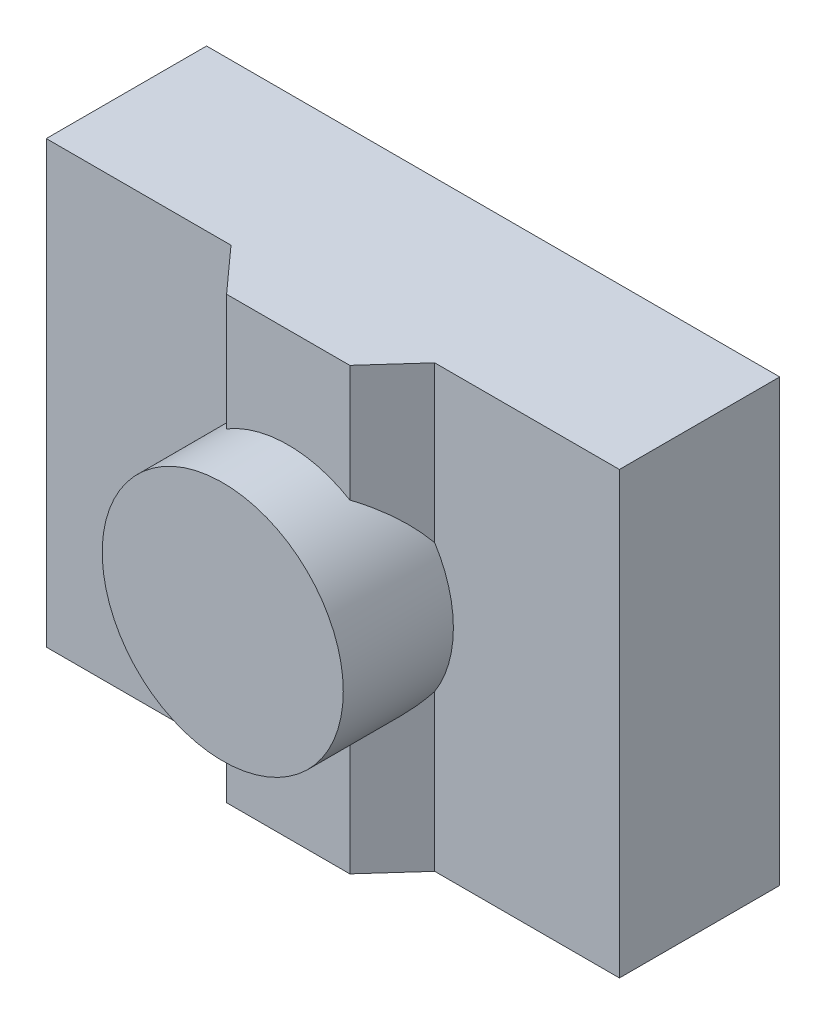
ISO-10303-21;
HEADER;
FILE_DESCRIPTION(('STEP AP214'),'2;1');
FILE_NAME('part.step','',(''),(''),'','','');
FILE_SCHEMA(('AUTOMOTIVE_DESIGN { 1 0 10303 214 1 1 1 1 }'));
ENDSEC;
DATA;
#1=APPLICATION_CONTEXT('core data for automotive mechanical design processes');
#2=APPLICATION_PROTOCOL_DEFINITION('international standard','automotive_design',2000,#1);
#3=PRODUCT_CONTEXT('',#1,'mechanical');
#4=PRODUCT('Part','Part','',(#3));
#5=PRODUCT_RELATED_PRODUCT_CATEGORY('part','',(#4));
#6=PRODUCT_DEFINITION_FORMATION('','',#4);
#7=PRODUCT_DEFINITION_CONTEXT('part definition',#1,'design');
#8=PRODUCT_DEFINITION('design','',#6,#7);
#9=PRODUCT_DEFINITION_SHAPE('','',#8);
#10=(LENGTH_UNIT() NAMED_UNIT(*) SI_UNIT(.MILLI.,.METRE.));
#11=(NAMED_UNIT(*) PLANE_ANGLE_UNIT() SI_UNIT($,.RADIAN.));
#12=(NAMED_UNIT(*) SI_UNIT($,.STERADIAN.) SOLID_ANGLE_UNIT());
#13=UNCERTAINTY_MEASURE_WITH_UNIT(LENGTH_MEASURE(1.E-05),#10,'distance_accuracy_value','');
#14=(GEOMETRIC_REPRESENTATION_CONTEXT(3) GLOBAL_UNCERTAINTY_ASSIGNED_CONTEXT((#13)) GLOBAL_UNIT_ASSIGNED_CONTEXT((#10,
#11,#12)) REPRESENTATION_CONTEXT('',''));
#15=CARTESIAN_POINT('',(0.,0.,0.));
#16=DIRECTION('',(0.,0.,1.));
#17=DIRECTION('',(1.,0.,0.));
#18=AXIS2_PLACEMENT_3D('',#15,#16,#17);
#19=CARTESIAN_POINT('',(89.6074006792826,-101.6,0.));
#20=DIRECTION('',(0.742879016624116,0.,0.669425699132911));
#21=DIRECTION('',(0.669425699132911,0.,-0.742879016624116));
#22=AXIS2_PLACEMENT_3D('',#19,#20,#21);
#23=PLANE('',#22);
#24=CARTESIAN_POINT('',(66.1113772506046,-50.8,26.0741450498472));
#25=DIRECTION('',(0.742879016624116,0.,0.669425699132911));
#26=DIRECTION('',(-0.669425699132911,0.,0.742879016624116));
#27=AXIS2_PLACEMENT_3D('',#24,#25,#26);
#28=ELLIPSE('',#27,41.5366121417821,27.8056756226251);
#29=CARTESIAN_POINT('',(89.6074006792826,-65.6691788565876,0.));
#30=VERTEX_POINT('',#29);
#31=CARTESIAN_POINT('',(80.3250210531382,-74.698282923368,10.3008968097811));
#32=VERTEX_POINT('',#31);
#33=EDGE_CURVE('E233',#30,#32,#28,.F.);
#34=ORIENTED_EDGE('',*,*,#33,.T.);
#35=DIRECTION('',(0.,1.,0.));
#36=VECTOR('',#35,1.);
#37=CARTESIAN_POINT('',(80.3250210531382,-101.6,10.3008968098083));
#38=LINE('',#37,#36);
#39=CARTESIAN_POINT('',(80.3250210531382,-101.6,10.3008968098083));
#40=VERTEX_POINT('',#39);
#41=EDGE_CURVE('E202',#40,#32,#38,.T.);
#42=ORIENTED_EDGE('',*,*,#41,.F.);
#43=DIRECTION('',(0.669425699132911,0.,-0.742879016624116));
#44=VECTOR('',#43,1.);
#45=CARTESIAN_POINT('',(89.6074006792826,-101.6,0.));
#46=LINE('',#45,#44);
#47=CARTESIAN_POINT('',(89.6074006792826,-101.6,0.));
#48=VERTEX_POINT('',#47);
#49=EDGE_CURVE('E166',#40,#48,#46,.T.);
#50=ORIENTED_EDGE('',*,*,#49,.T.);
#51=DIRECTION('',(0.,1.,0.));
#52=VECTOR('',#51,1.);
#53=CARTESIAN_POINT('',(89.6074006792826,-101.6,0.));
#54=LINE('',#53,#52);
#55=EDGE_CURVE('E199',#48,#30,#54,.T.);
#56=ORIENTED_EDGE('',*,*,#55,.T.);
#57=EDGE_LOOP('',(#34,#42,#50,#56));
#58=FACE_BOUND('',#57,.T.);
#59=ADVANCED_FACE('F30',(#58),#23,.T.);
#60=CARTESIAN_POINT('',(51.8977334480709,-101.6,10.3008968098083));
#61=DIRECTION('',(0.,0.,1.));
#62=DIRECTION('',(1.,0.,0.));
#63=AXIS2_PLACEMENT_3D('',#60,#61,#62);
#64=PLANE('',#63);
#65=CARTESIAN_POINT('',(66.1113772506046,-50.8,10.3008968097811));
#66=DIRECTION('',(0.,0.,1.));
#67=DIRECTION('',(1.,0.,0.));
#68=AXIS2_PLACEMENT_3D('',#65,#66,#67);
#69=CIRCLE('',#68,27.8056756226251);
#70=CARTESIAN_POINT('',(51.8977334480709,-26.9017170766379,10.3008968098083));
#71=VERTEX_POINT('',#70);
#72=CARTESIAN_POINT('',(80.3250210531382,-26.901717076632,10.3008968097811));
#73=VERTEX_POINT('',#72);
#74=EDGE_CURVE('E231',#71,#73,#69,.F.);
#75=ORIENTED_EDGE('',*,*,#74,.T.);
#76=CARTESIAN_POINT('',(80.3250210531382,0.,10.3008968098083));
#77=VERTEX_POINT('',#76);
#78=EDGE_CURVE('E205',#73,#77,#38,.T.);
#79=ORIENTED_EDGE('',*,*,#78,.T.);
#80=DIRECTION('',(1.,0.,0.));
#81=VECTOR('',#80,1.);
#82=CARTESIAN_POINT('',(51.8977334480709,0.,10.3008968098083));
#83=LINE('',#82,#81);
#84=CARTESIAN_POINT('',(51.8977334480709,0.,10.3008968098083));
#85=VERTEX_POINT('',#84);
#86=EDGE_CURVE('E187',#85,#77,#83,.T.);
#87=ORIENTED_EDGE('',*,*,#86,.F.);
#88=DIRECTION('',(0.,1.,0.));
#89=VECTOR('',#88,1.);
#90=CARTESIAN_POINT('',(51.8977334480709,-101.6,10.3008968098083));
#91=LINE('',#90,#89);
#92=EDGE_CURVE('E131',#71,#85,#91,.T.);
#93=ORIENTED_EDGE('',*,*,#92,.F.);
#94=EDGE_LOOP('',(#75,#79,#87,#93));
#95=FACE_BOUND('',#94,.T.);
#96=ADVANCED_FACE('F238',(#95),#64,.T.);
#97=CARTESIAN_POINT('',(42.6153538219265,-101.6,0.));
#98=DIRECTION('',(-0.742879016624116,0.,0.669425699132911));
#99=DIRECTION('',(0.669425699132911,0.,0.742879016624116));
#100=AXIS2_PLACEMENT_3D('',#97,#98,#99);
#101=PLANE('',#100);
#102=CARTESIAN_POINT('',(66.1113772506046,-50.8,26.0741450498472));
#103=DIRECTION('',(-0.742879016624116,0.,0.669425699132911));
#104=DIRECTION('',(0.669425699132911,0.,0.742879016624116));
#105=AXIS2_PLACEMENT_3D('',#102,#103,#104);
#106=ELLIPSE('',#105,41.5366121417821,27.8056756226251);
#107=CARTESIAN_POINT('',(42.6153538219265,-35.9308211433968,0.));
#108=VERTEX_POINT('',#107);
#109=EDGE_CURVE('E141',#108,#71,#106,.F.);
#110=ORIENTED_EDGE('',*,*,#109,.T.);
#111=ORIENTED_EDGE('',*,*,#92,.T.);
#112=DIRECTION('',(0.669425699132911,0.,0.742879016624116));
#113=VECTOR('',#112,1.);
#114=CARTESIAN_POINT('',(42.6153538219265,0.,0.));
#115=LINE('',#114,#113);
#116=CARTESIAN_POINT('',(42.6153538219265,0.,0.));
#117=VERTEX_POINT('',#116);
#118=EDGE_CURVE('E184',#117,#85,#115,.T.);
#119=ORIENTED_EDGE('',*,*,#118,.F.);
#120=DIRECTION('',(0.,1.,0.));
#121=VECTOR('',#120,1.);
#122=CARTESIAN_POINT('',(42.6153538219265,-101.6,0.));
#123=LINE('',#122,#121);
#124=EDGE_CURVE('E132',#108,#117,#123,.T.);
#125=ORIENTED_EDGE('',*,*,#124,.F.);
#126=EDGE_LOOP('',(#110,#111,#119,#125));
#127=FACE_BOUND('',#126,.T.);
#128=ADVANCED_FACE('F244',(#127),#101,.T.);
#129=CARTESIAN_POINT('',(0.,-101.6,-36.9812244108649));
#130=DIRECTION('',(0.,0.,-1.));
#131=DIRECTION('',(-1.,0.,0.));
#132=AXIS2_PLACEMENT_3D('',#129,#130,#131);
#133=PLANE('',#132);
#134=DIRECTION('',(-1.,0.,0.));
#135=VECTOR('',#134,1.);
#136=CARTESIAN_POINT('',(0.,0.,-36.9812244108649));
#137=LINE('',#136,#135);
#138=CARTESIAN_POINT('',(132.222754501209,0.,-36.9812244108649));
#139=VERTEX_POINT('',#138);
#140=CARTESIAN_POINT('',(0.,0.,-36.9812244108649));
#141=VERTEX_POINT('',#140);
#142=EDGE_CURVE('E175',#139,#141,#137,.T.);
#143=ORIENTED_EDGE('',*,*,#142,.F.);
#144=DIRECTION('',(0.,1.,0.));
#145=VECTOR('',#144,1.);
#146=CARTESIAN_POINT('',(132.222754501209,-101.6,-36.9812244108649));
#147=LINE('',#146,#145);
#148=CARTESIAN_POINT('',(132.222754501209,-101.6,-36.9812244108649));
#149=VERTEX_POINT('',#148);
#150=EDGE_CURVE('E11',#149,#139,#147,.T.);
#151=ORIENTED_EDGE('',*,*,#150,.F.);
#152=DIRECTION('',(-1.,0.,0.));
#153=VECTOR('',#152,1.);
#154=CARTESIAN_POINT('',(0.,-101.6,-36.9812244108649));
#155=LINE('',#154,#153);
#156=CARTESIAN_POINT('',(0.,-101.6,-36.9812244108649));
#157=VERTEX_POINT('',#156);
#158=EDGE_CURVE('E153',#149,#157,#155,.T.);
#159=ORIENTED_EDGE('',*,*,#158,.T.);
#160=DIRECTION('',(0.,1.,0.));
#161=VECTOR('',#160,1.);
#162=CARTESIAN_POINT('',(0.,-101.6,-36.9812244108649));
#163=LINE('',#162,#161);
#164=EDGE_CURVE('E34',#157,#141,#163,.T.);
#165=ORIENTED_EDGE('',*,*,#164,.T.);
#166=EDGE_LOOP('',(#143,#151,#159,#165));
#167=FACE_BOUND('',#166,.T.);
#168=ADVANCED_FACE('F32',(#167),#133,.T.);
#169=CARTESIAN_POINT('',(132.222754501209,-101.6,-36.9812244108649));
#170=DIRECTION('',(1.,0.,0.));
#171=DIRECTION('',(0.,0.,-1.));
#172=AXIS2_PLACEMENT_3D('',#169,#170,#171);
#173=PLANE('',#172);
#174=DIRECTION('',(0.,0.,-1.));
#175=VECTOR('',#174,1.);
#176=CARTESIAN_POINT('',(132.222754501209,0.,-36.9812244108649));
#177=LINE('',#176,#175);
#178=CARTESIAN_POINT('',(132.222754501209,0.,0.));
#179=VERTEX_POINT('',#178);
#180=EDGE_CURVE('E157',#179,#139,#177,.T.);
#181=ORIENTED_EDGE('',*,*,#180,.F.);
#182=DIRECTION('',(0.,1.,0.));
#183=VECTOR('',#182,1.);
#184=CARTESIAN_POINT('',(132.222754501209,-101.6,0.));
#185=LINE('',#184,#183);
#186=CARTESIAN_POINT('',(132.222754501209,-101.6,0.));
#187=VERTEX_POINT('',#186);
#188=EDGE_CURVE('E39',#187,#179,#185,.T.);
#189=ORIENTED_EDGE('',*,*,#188,.F.);
#190=DIRECTION('',(0.,0.,-1.));
#191=VECTOR('',#190,1.);
#192=CARTESIAN_POINT('',(132.222754501209,-101.6,-36.9812244108649));
#193=LINE('',#192,#191);
#194=EDGE_CURVE('E172',#187,#149,#193,.T.);
#195=ORIENTED_EDGE('',*,*,#194,.T.);
#196=ORIENTED_EDGE('',*,*,#150,.T.);
#197=EDGE_LOOP('',(#181,#189,#195,#196));
#198=FACE_BOUND('',#197,.T.);
#199=ADVANCED_FACE('F220',(#198),#173,.T.);
#200=CARTESIAN_POINT('',(132.222754501209,-101.6,0.));
#201=DIRECTION('',(0.,0.,1.));
#202=DIRECTION('',(1.,0.,0.));
#203=AXIS2_PLACEMENT_3D('',#200,#201,#202);
#204=PLANE('',#203);
#205=CARTESIAN_POINT('',(66.1113772506046,-50.8,0.));
#206=DIRECTION('',(0.,0.,1.));
#207=DIRECTION('',(1.,0.,0.));
#208=AXIS2_PLACEMENT_3D('',#205,#206,#207);
#209=CIRCLE('',#208,27.8056756226251);
#210=CARTESIAN_POINT('',(89.6074006792826,-35.9308211434124,0.));
#211=VERTEX_POINT('',#210);
#212=EDGE_CURVE('E54',#211,#30,#209,.F.);
#213=ORIENTED_EDGE('',*,*,#212,.T.);
#214=ORIENTED_EDGE('',*,*,#55,.F.);
#215=DIRECTION('',(1.,0.,0.));
#216=VECTOR('',#215,1.);
#217=CARTESIAN_POINT('',(132.222754501209,-101.6,0.));
#218=LINE('',#217,#216);
#219=EDGE_CURVE('E169',#48,#187,#218,.T.);
#220=ORIENTED_EDGE('',*,*,#219,.T.);
#221=ORIENTED_EDGE('',*,*,#188,.T.);
#222=DIRECTION('',(1.,0.,0.));
#223=VECTOR('',#222,1.);
#224=CARTESIAN_POINT('',(132.222754501209,0.,0.));
#225=LINE('',#224,#223);
#226=CARTESIAN_POINT('',(89.6074006792826,0.,0.));
#227=VERTEX_POINT('',#226);
#228=EDGE_CURVE('E193',#227,#179,#225,.T.);
#229=ORIENTED_EDGE('',*,*,#228,.F.);
#230=EDGE_CURVE('E201',#211,#227,#54,.T.);
#231=ORIENTED_EDGE('',*,*,#230,.F.);
#232=EDGE_LOOP('',(#213,#214,#220,#221,#229,#231));
#233=FACE_BOUND('',#232,.T.);
#234=ADVANCED_FACE('F262',(#233),#204,.T.);
#235=EDGE_CURVE('E47',#73,#211,#28,.F.);
#236=ORIENTED_EDGE('',*,*,#235,.T.);
#237=ORIENTED_EDGE('',*,*,#230,.T.);
#238=DIRECTION('',(0.669425699132911,0.,-0.742879016624116));
#239=VECTOR('',#238,1.);
#240=CARTESIAN_POINT('',(89.6074006792826,0.,0.));
#241=LINE('',#240,#239);
#242=EDGE_CURVE('E190',#77,#227,#241,.T.);
#243=ORIENTED_EDGE('',*,*,#242,.F.);
#244=ORIENTED_EDGE('',*,*,#78,.F.);
#245=EDGE_LOOP('',(#236,#237,#243,#244));
#246=FACE_BOUND('',#245,.T.);
#247=ADVANCED_FACE('F241',(#246),#23,.T.);
#248=CARTESIAN_POINT('',(51.8977334480709,-74.6982829233621,10.3008968098083));
#249=VERTEX_POINT('',#248);
#250=EDGE_CURVE('E229',#32,#249,#69,.F.);
#251=ORIENTED_EDGE('',*,*,#250,.T.);
#252=CARTESIAN_POINT('',(51.8977334480709,-101.6,10.3008968098083));
#253=VERTEX_POINT('',#252);
#254=EDGE_CURVE('E138',#253,#249,#91,.T.);
#255=ORIENTED_EDGE('',*,*,#254,.F.);
#256=DIRECTION('',(1.,0.,0.));
#257=VECTOR('',#256,1.);
#258=CARTESIAN_POINT('',(51.8977334480709,-101.6,10.3008968098083));
#259=LINE('',#258,#257);
#260=EDGE_CURVE('E163',#253,#40,#259,.T.);
#261=ORIENTED_EDGE('',*,*,#260,.T.);
#262=ORIENTED_EDGE('',*,*,#41,.T.);
#263=EDGE_LOOP('',(#251,#255,#261,#262));
#264=FACE_BOUND('',#263,.T.);
#265=ADVANCED_FACE('F228',(#264),#64,.T.);
#266=CARTESIAN_POINT('',(42.6153538219265,-65.6691788565876,0.));
#267=VERTEX_POINT('',#266);
#268=EDGE_CURVE('E136',#249,#267,#106,.F.);
#269=ORIENTED_EDGE('',*,*,#268,.T.);
#270=CARTESIAN_POINT('',(42.6153538219265,-101.6,0.));
#271=VERTEX_POINT('',#270);
#272=EDGE_CURVE('E120',#271,#267,#123,.T.);
#273=ORIENTED_EDGE('',*,*,#272,.F.);
#274=DIRECTION('',(0.669425699132911,0.,0.742879016624116));
#275=VECTOR('',#274,1.);
#276=CARTESIAN_POINT('',(42.6153538219265,-101.6,0.));
#277=LINE('',#276,#275);
#278=EDGE_CURVE('E161',#271,#253,#277,.T.);
#279=ORIENTED_EDGE('',*,*,#278,.T.);
#280=ORIENTED_EDGE('',*,*,#254,.T.);
#281=EDGE_LOOP('',(#269,#273,#279,#280));
#282=FACE_BOUND('',#281,.T.);
#283=ADVANCED_FACE('F137',(#282),#101,.T.);
#284=CARTESIAN_POINT('',(0.,-101.6,0.));
#285=DIRECTION('',(0.,0.,1.));
#286=DIRECTION('',(1.,0.,0.));
#287=AXIS2_PLACEMENT_3D('',#284,#285,#286);
#288=PLANE('',#287);
#289=CARTESIAN_POINT('',(66.1113772506046,-50.8,0.));
#290=DIRECTION('',(0.,0.,1.));
#291=DIRECTION('',(1.,0.,0.));
#292=AXIS2_PLACEMENT_3D('',#289,#290,#291);
#293=CIRCLE('',#292,27.8056756226251);
#294=EDGE_CURVE('E124',#267,#108,#293,.F.);
#295=ORIENTED_EDGE('',*,*,#294,.T.);
#296=ORIENTED_EDGE('',*,*,#124,.T.);
#297=DIRECTION('',(1.,0.,0.));
#298=VECTOR('',#297,1.);
#299=CARTESIAN_POINT('',(0.,0.,0.));
#300=LINE('',#299,#298);
#301=CARTESIAN_POINT('',(0.,0.,0.));
#302=VERTEX_POINT('',#301);
#303=EDGE_CURVE('E181',#302,#117,#300,.T.);
#304=ORIENTED_EDGE('',*,*,#303,.F.);
#305=DIRECTION('',(0.,1.,0.));
#306=VECTOR('',#305,1.);
#307=CARTESIAN_POINT('',(0.,-101.6,0.));
#308=LINE('',#307,#306);
#309=CARTESIAN_POINT('',(0.,-101.6,0.));
#310=VERTEX_POINT('',#309);
#311=EDGE_CURVE('E206',#310,#302,#308,.T.);
#312=ORIENTED_EDGE('',*,*,#311,.F.);
#313=DIRECTION('',(1.,0.,0.));
#314=VECTOR('',#313,1.);
#315=CARTESIAN_POINT('',(0.,-101.6,0.));
#316=LINE('',#315,#314);
#317=EDGE_CURVE('E127',#310,#271,#316,.T.);
#318=ORIENTED_EDGE('',*,*,#317,.T.);
#319=ORIENTED_EDGE('',*,*,#272,.T.);
#320=EDGE_LOOP('',(#295,#296,#304,#312,#318,#319));
#321=FACE_BOUND('',#320,.T.);
#322=ADVANCED_FACE('F122',(#321),#288,.T.);
#323=CARTESIAN_POINT('',(0.,-101.6,-36.9812244108649));
#324=DIRECTION('',(-1.,0.,0.));
#325=DIRECTION('',(0.,0.,1.));
#326=AXIS2_PLACEMENT_3D('',#323,#324,#325);
#327=PLANE('',#326);
#328=DIRECTION('',(0.,0.,1.));
#329=VECTOR('',#328,1.);
#330=CARTESIAN_POINT('',(0.,0.,-36.9812244108649));
#331=LINE('',#330,#329);
#332=EDGE_CURVE('E178',#141,#302,#331,.T.);
#333=ORIENTED_EDGE('',*,*,#332,.F.);
#334=ORIENTED_EDGE('',*,*,#164,.F.);
#335=DIRECTION('',(0.,0.,1.));
#336=VECTOR('',#335,1.);
#337=CARTESIAN_POINT('',(0.,-101.6,-36.9812244108649));
#338=LINE('',#337,#336);
#339=EDGE_CURVE('E156',#157,#310,#338,.T.);
#340=ORIENTED_EDGE('',*,*,#339,.T.);
#341=ORIENTED_EDGE('',*,*,#311,.T.);
#342=EDGE_LOOP('',(#333,#334,#340,#341));
#343=FACE_BOUND('',#342,.T.);
#344=ADVANCED_FACE('F214',(#343),#327,.T.);
#345=CARTESIAN_POINT('',(132.222754501209,-101.6,-36.9812244108649));
#346=DIRECTION('',(0.,-1.,0.));
#347=DIRECTION('',(0.,0.,-1.));
#348=AXIS2_PLACEMENT_3D('',#345,#346,#347);
#349=PLANE('',#348);
#350=ORIENTED_EDGE('',*,*,#158,.F.);
#351=ORIENTED_EDGE('',*,*,#194,.F.);
#352=ORIENTED_EDGE('',*,*,#219,.F.);
#353=ORIENTED_EDGE('',*,*,#49,.F.);
#354=ORIENTED_EDGE('',*,*,#260,.F.);
#355=ORIENTED_EDGE('',*,*,#278,.F.);
#356=ORIENTED_EDGE('',*,*,#317,.F.);
#357=ORIENTED_EDGE('',*,*,#339,.F.);
#358=EDGE_LOOP('',(#350,#351,#352,#353,#354,#355,#356,#357));
#359=FACE_BOUND('',#358,.T.);
#360=ADVANCED_FACE('F223',(#359),#349,.T.);
#361=CARTESIAN_POINT('',(132.222754501209,0.,-36.9812244108649));
#362=DIRECTION('',(0.,-1.,0.));
#363=DIRECTION('',(0.,0.,-1.));
#364=AXIS2_PLACEMENT_3D('',#361,#362,#363);
#365=PLANE('',#364);
#366=ORIENTED_EDGE('',*,*,#142,.T.);
#367=ORIENTED_EDGE('',*,*,#332,.T.);
#368=ORIENTED_EDGE('',*,*,#303,.T.);
#369=ORIENTED_EDGE('',*,*,#118,.T.);
#370=ORIENTED_EDGE('',*,*,#86,.T.);
#371=ORIENTED_EDGE('',*,*,#242,.T.);
#372=ORIENTED_EDGE('',*,*,#228,.T.);
#373=ORIENTED_EDGE('',*,*,#180,.T.);
#374=EDGE_LOOP('',(#366,#367,#368,#369,#370,#371,#372,#373));
#375=FACE_BOUND('',#374,.T.);
#376=ADVANCED_FACE('F216',(#375),#365,.F.);
#377=CARTESIAN_POINT('',(66.1113772506046,-50.8,25.4));
#378=DIRECTION('',(0.,0.,1.));
#379=DIRECTION('',(1.,0.,0.));
#380=AXIS2_PLACEMENT_3D('',#377,#378,#379);
#381=PLANE('',#380);
#382=CARTESIAN_POINT('',(66.1113772506046,-50.8,25.4));
#383=DIRECTION('',(0.,0.,1.));
#384=DIRECTION('',(1.,0.,0.));
#385=AXIS2_PLACEMENT_3D('',#382,#383,#384);
#386=CIRCLE('',#385,27.8056756226251);
#387=CARTESIAN_POINT('',(93.9170528732296,-50.8,25.4));
#388=VERTEX_POINT('',#387);
#389=EDGE_CURVE('E147',#388,#388,#386,.T.);
#390=ORIENTED_EDGE('',*,*,#389,.T.);
#391=EDGE_LOOP('',(#390));
#392=FACE_BOUND('',#391,.T.);
#393=ADVANCED_FACE('F273',(#392),#381,.T.);
#394=CARTESIAN_POINT('',(66.1113772506046,-50.8,-500000.));
#395=DIRECTION('',(0.,0.,1.));
#396=DIRECTION('',(1.,0.,0.));
#397=AXIS2_PLACEMENT_3D('',#394,#395,#396);
#398=CYLINDRICAL_SURFACE('',#397,27.8056756226251);
#399=ORIENTED_EDGE('',*,*,#294,.F.);
#400=ORIENTED_EDGE('',*,*,#268,.F.);
#401=ORIENTED_EDGE('',*,*,#250,.F.);
#402=ORIENTED_EDGE('',*,*,#33,.F.);
#403=ORIENTED_EDGE('',*,*,#212,.F.);
#404=ORIENTED_EDGE('',*,*,#235,.F.);
#405=ORIENTED_EDGE('',*,*,#74,.F.);
#406=ORIENTED_EDGE('',*,*,#109,.F.);
#407=EDGE_LOOP('',(#399,#400,#401,#402,#403,#404,#405,#406));
#408=FACE_BOUND('',#407,.T.);
#409=ORIENTED_EDGE('',*,*,#389,.F.);
#410=EDGE_LOOP('',(#409));
#411=FACE_BOUND('',#410,.T.);
#412=ADVANCED_FACE('F144',(#408,#411),#398,.T.);
#413=CLOSED_SHELL('',(#59,#96,#128,#168,#199,#234,#247,#265,#283,#322,#344,#360,#376,#393,#412));
#414=MANIFOLD_SOLID_BREP('B2',#413);
#415=ADVANCED_BREP_SHAPE_REPRESENTATION('',(#18,#414),#14);
#416=SHAPE_DEFINITION_REPRESENTATION(#9,#415);
ENDSEC;
END-ISO-10303-21;
